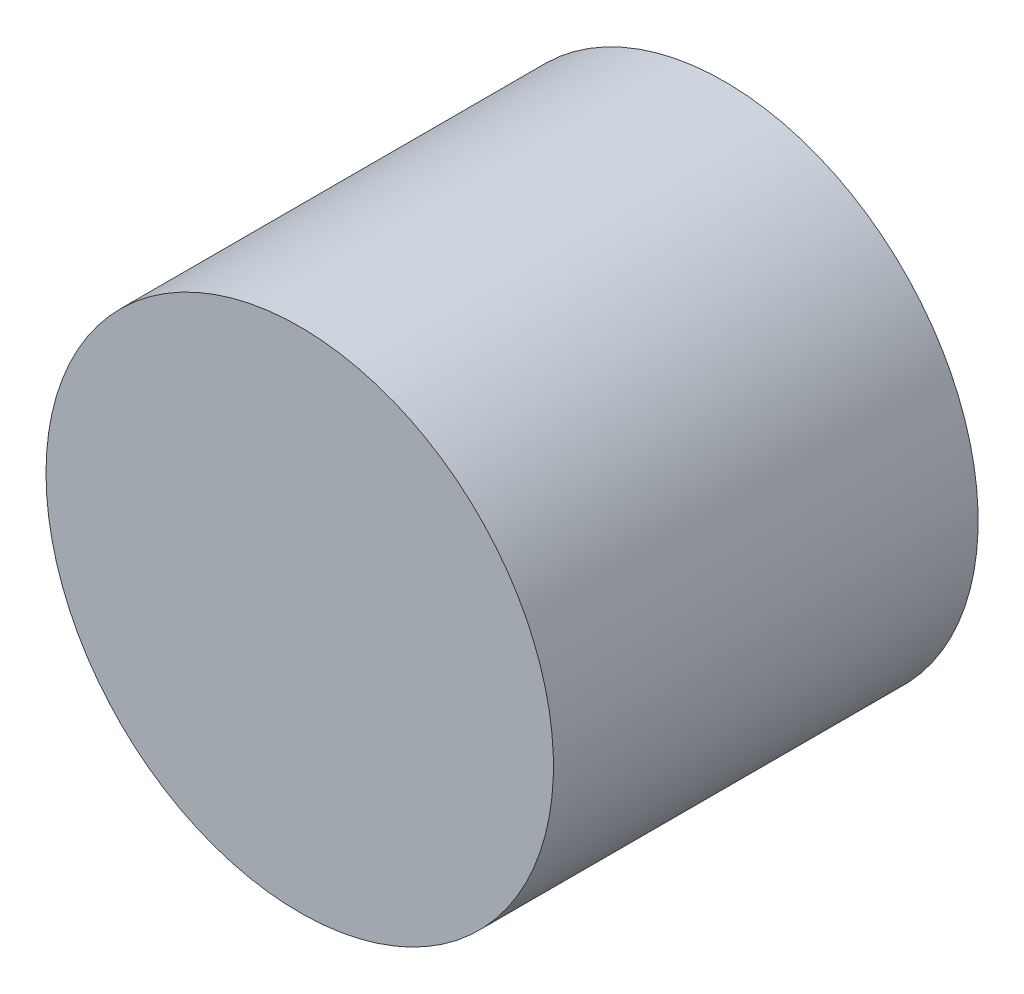
ISO-10303-21;
HEADER;
FILE_DESCRIPTION(('STEP AP214'),'2;1');
FILE_NAME('part.step','',(''),(''),'','','');
FILE_SCHEMA(('AUTOMOTIVE_DESIGN { 1 0 10303 214 1 1 1 1 }'));
ENDSEC;
DATA;
#1=APPLICATION_CONTEXT('core data for automotive mechanical design processes');
#2=APPLICATION_PROTOCOL_DEFINITION('international standard','automotive_design',2000,#1);
#3=PRODUCT_CONTEXT('',#1,'mechanical');
#4=PRODUCT('Part','Part','',(#3));
#5=PRODUCT_RELATED_PRODUCT_CATEGORY('part','',(#4));
#6=PRODUCT_DEFINITION_FORMATION('','',#4);
#7=PRODUCT_DEFINITION_CONTEXT('part definition',#1,'design');
#8=PRODUCT_DEFINITION('design','',#6,#7);
#9=PRODUCT_DEFINITION_SHAPE('','',#8);
#10=(LENGTH_UNIT() NAMED_UNIT(*) SI_UNIT(.MILLI.,.METRE.));
#11=(NAMED_UNIT(*) PLANE_ANGLE_UNIT() SI_UNIT($,.RADIAN.));
#12=(NAMED_UNIT(*) SI_UNIT($,.STERADIAN.) SOLID_ANGLE_UNIT());
#13=UNCERTAINTY_MEASURE_WITH_UNIT(LENGTH_MEASURE(1.E-05),#10,'distance_accuracy_value','');
#14=(GEOMETRIC_REPRESENTATION_CONTEXT(3) GLOBAL_UNCERTAINTY_ASSIGNED_CONTEXT((#13)) GLOBAL_UNIT_ASSIGNED_CONTEXT((#10,
#11,#12)) REPRESENTATION_CONTEXT('',''));
#15=CARTESIAN_POINT('',(0.,0.,0.));
#16=DIRECTION('',(0.,0.,1.));
#17=DIRECTION('',(1.,0.,0.));
#18=AXIS2_PLACEMENT_3D('',#15,#16,#17);
#19=CARTESIAN_POINT('',(-0.73937913570371,0.684339816773041,7.7));
#20=DIRECTION('',(0.,0.,-1.));
#21=DIRECTION('',(-1.,0.,0.));
#22=AXIS2_PLACEMENT_3D('',#19,#20,#21);
#23=CYLINDRICAL_SURFACE('',#22,4.59999999999999);
#24=CARTESIAN_POINT('',(-0.73937913570371,0.684339816773041,7.7));
#25=DIRECTION('',(0.,0.,1.));
#26=DIRECTION('',(1.,0.,0.));
#27=AXIS2_PLACEMENT_3D('',#24,#25,#26);
#28=CIRCLE('',#27,4.59999999999999);
#29=CARTESIAN_POINT('',(-5.3393791357037,0.684339816773041,7.7));
#30=VERTEX_POINT('',#29);
#31=EDGE_CURVE('E10',#30,#30,#28,.T.);
#32=CARTESIAN_POINT('',(-0.73937913570371,0.684339816773041,0.));
#33=DIRECTION('',(0.,0.,1.));
#34=DIRECTION('',(1.,0.,0.));
#35=AXIS2_PLACEMENT_3D('',#32,#33,#34);
#36=CIRCLE('',#35,4.59999999999999);
#37=CARTESIAN_POINT('',(-5.3393791357037,0.684339816773041,0.));
#38=VERTEX_POINT('',#37);
#39=EDGE_CURVE('E38',#38,#38,#36,.T.);
#40=CARTESIAN_POINT('',(-5.3393791357037,0.684339816773041,7.7));
#41=CARTESIAN_POINT('',(-5.3393791357037,0.684339816773041,7.61979166666667));
#42=CARTESIAN_POINT('',(-5.3393791357037,0.684339816773041,7.53958333333333));
#43=CARTESIAN_POINT('',(-5.3393791357037,0.684339816773041,7.37916666666667));
#44=CARTESIAN_POINT('',(-5.3393791357037,0.684339816773041,7.29895833333333));
#45=CARTESIAN_POINT('',(-5.3393791357037,0.684339816773041,7.13854166666667));
#46=CARTESIAN_POINT('',(-5.3393791357037,0.684339816773041,7.05833333333333));
#47=CARTESIAN_POINT('',(-5.3393791357037,0.684339816773041,6.89791666666667));
#48=CARTESIAN_POINT('',(-5.3393791357037,0.684339816773041,6.81770833333333));
#49=CARTESIAN_POINT('',(-5.3393791357037,0.684339816773041,6.65729166666667));
#50=CARTESIAN_POINT('',(-5.3393791357037,0.684339816773041,6.57708333333333));
#51=CARTESIAN_POINT('',(-5.3393791357037,0.684339816773041,6.41666666666667));
#52=CARTESIAN_POINT('',(-5.3393791357037,0.684339816773041,6.33645833333333));
#53=CARTESIAN_POINT('',(-5.3393791357037,0.684339816773041,6.17604166666667));
#54=CARTESIAN_POINT('',(-5.3393791357037,0.684339816773041,6.09583333333333));
#55=CARTESIAN_POINT('',(-5.3393791357037,0.684339816773041,5.93541666666667));
#56=CARTESIAN_POINT('',(-5.3393791357037,0.684339816773041,5.85520833333333));
#57=CARTESIAN_POINT('',(-5.3393791357037,0.684339816773041,5.69479166666667));
#58=CARTESIAN_POINT('',(-5.3393791357037,0.684339816773041,5.61458333333333));
#59=CARTESIAN_POINT('',(-5.3393791357037,0.684339816773041,5.45416666666667));
#60=CARTESIAN_POINT('',(-5.3393791357037,0.684339816773041,5.37395833333333));
#61=CARTESIAN_POINT('',(-5.3393791357037,0.684339816773041,5.21354166666667));
#62=CARTESIAN_POINT('',(-5.3393791357037,0.684339816773041,5.13333333333333));
#63=CARTESIAN_POINT('',(-5.3393791357037,0.684339816773041,4.97291666666667));
#64=CARTESIAN_POINT('',(-5.3393791357037,0.684339816773041,4.89270833333333));
#65=CARTESIAN_POINT('',(-5.3393791357037,0.684339816773041,4.73229166666667));
#66=CARTESIAN_POINT('',(-5.3393791357037,0.684339816773041,4.65208333333333));
#67=CARTESIAN_POINT('',(-5.3393791357037,0.684339816773041,4.49166666666667));
#68=CARTESIAN_POINT('',(-5.3393791357037,0.684339816773041,4.41145833333333));
#69=CARTESIAN_POINT('',(-5.3393791357037,0.684339816773041,4.25104166666667));
#70=CARTESIAN_POINT('',(-5.3393791357037,0.684339816773041,4.17083333333333));
#71=CARTESIAN_POINT('',(-5.3393791357037,0.684339816773041,4.01041666666667));
#72=CARTESIAN_POINT('',(-5.3393791357037,0.684339816773041,3.93020833333333));
#73=CARTESIAN_POINT('',(-5.3393791357037,0.684339816773041,3.76979166666667));
#74=CARTESIAN_POINT('',(-5.3393791357037,0.684339816773041,3.68958333333333));
#75=CARTESIAN_POINT('',(-5.3393791357037,0.684339816773041,3.52916666666667));
#76=CARTESIAN_POINT('',(-5.3393791357037,0.684339816773041,3.44895833333333));
#77=CARTESIAN_POINT('',(-5.3393791357037,0.684339816773041,3.28854166666667));
#78=CARTESIAN_POINT('',(-5.3393791357037,0.684339816773041,3.20833333333333));
#79=CARTESIAN_POINT('',(-5.3393791357037,0.684339816773041,3.04791666666667));
#80=CARTESIAN_POINT('',(-5.3393791357037,0.684339816773041,2.96770833333333));
#81=CARTESIAN_POINT('',(-5.3393791357037,0.684339816773041,2.80729166666667));
#82=CARTESIAN_POINT('',(-5.3393791357037,0.684339816773041,2.72708333333333));
#83=CARTESIAN_POINT('',(-5.3393791357037,0.684339816773041,2.56666666666667));
#84=CARTESIAN_POINT('',(-5.3393791357037,0.684339816773041,2.48645833333333));
#85=CARTESIAN_POINT('',(-5.3393791357037,0.684339816773041,2.32604166666667));
#86=CARTESIAN_POINT('',(-5.3393791357037,0.684339816773041,2.24583333333333));
#87=CARTESIAN_POINT('',(-5.3393791357037,0.684339816773041,2.08541666666667));
#88=CARTESIAN_POINT('',(-5.3393791357037,0.684339816773041,2.00520833333333));
#89=CARTESIAN_POINT('',(-5.3393791357037,0.684339816773041,1.84479166666667));
#90=CARTESIAN_POINT('',(-5.3393791357037,0.684339816773041,1.76458333333333));
#91=CARTESIAN_POINT('',(-5.3393791357037,0.684339816773041,1.60416666666667));
#92=CARTESIAN_POINT('',(-5.3393791357037,0.684339816773041,1.52395833333333));
#93=CARTESIAN_POINT('',(-5.3393791357037,0.684339816773041,1.36354166666667));
#94=CARTESIAN_POINT('',(-5.3393791357037,0.684339816773041,1.28333333333333));
#95=CARTESIAN_POINT('',(-5.3393791357037,0.684339816773041,1.12291666666667));
#96=CARTESIAN_POINT('',(-5.3393791357037,0.684339816773041,1.04270833333333));
#97=CARTESIAN_POINT('',(-5.3393791357037,0.684339816773041,0.882291666666666));
#98=CARTESIAN_POINT('',(-5.3393791357037,0.684339816773041,0.802083333333333));
#99=CARTESIAN_POINT('',(-5.3393791357037,0.684339816773041,0.641666666666666));
#100=CARTESIAN_POINT('',(-5.3393791357037,0.684339816773041,0.561458333333332));
#101=CARTESIAN_POINT('',(-5.3393791357037,0.684339816773041,0.401041666666666));
#102=CARTESIAN_POINT('',(-5.3393791357037,0.684339816773041,0.320833333333333));
#103=CARTESIAN_POINT('',(-5.3393791357037,0.684339816773041,0.160416666666666));
#104=CARTESIAN_POINT('',(-5.3393791357037,0.684339816773041,0.0802083333333325));
#105=CARTESIAN_POINT('',(-5.3393791357037,0.684339816773041,0.));
#106=B_SPLINE_CURVE_WITH_KNOTS('',3,(#40,#41,#42,#43,#44,#45,#46,#47,#48,#49,#50,#51,#52,#53,
#54,#55,#56,#57,#58,#59,#60,#61,#62,#63,#64,#65,#66,#67,#68,#69,#70,#71,#72,#73,#74,#75,#76,#77,
#78,#79,#80,#81,#82,#83,#84,#85,#86,#87,#88,#89,#90,#91,#92,#93,#94,#95,#96,#97,#98,#99,#100,
#101,#102,#103,#104,#105),.UNSPECIFIED.,.F.,.F.,(4,2,2,2,2,2,2,2,2,2,2,2,2,2,2,2,2,2,2,2,2,2,2,
2,2,2,2,2,2,2,2,2,4),(0.,0.240625,0.481250000000001,0.721875,0.962500000000001,1.203125,1.44375,
1.684375,1.925,2.165625,2.40625,2.646875,2.8875,3.128125,3.36875,3.609375,3.85,4.090625,4.33125,
4.571875,4.8125,5.053125,5.29375,5.534375,5.775,6.015625,6.25625,6.496875,6.7375,6.978125,
7.21875,7.459375,7.7),.UNSPECIFIED.);
#107=EDGE_CURVE('BSEAM35',#30,#38,#106,.T.);
#108=ORIENTED_EDGE('',*,*,#31,.F.);
#109=ORIENTED_EDGE('',*,*,#39,.T.);
#110=ORIENTED_EDGE('',*,*,#107,.T.);
#111=ORIENTED_EDGE('',*,*,#107,.F.);
#112=EDGE_LOOP('',(#108,#110,#109,#111));
#113=FACE_BOUND('',#112,.T.);
#114=ADVANCED_FACE('F35',(#113),#23,.T.);
#115=CARTESIAN_POINT('',(-0.73937913570371,0.684339816773041,7.7));
#116=DIRECTION('',(0.,0.,1.));
#117=DIRECTION('',(1.,0.,0.));
#118=AXIS2_PLACEMENT_3D('',#115,#116,#117);
#119=PLANE('',#118);
#120=ORIENTED_EDGE('',*,*,#31,.T.);
#121=EDGE_LOOP('',(#120));
#122=FACE_BOUND('',#121,.T.);
#123=ADVANCED_FACE('F50',(#122),#119,.T.);
#124=CARTESIAN_POINT('',(-0.73937913570371,0.684339816773041,0.));
#125=DIRECTION('',(0.,0.,1.));
#126=DIRECTION('',(1.,0.,0.));
#127=AXIS2_PLACEMENT_3D('',#124,#125,#126);
#128=PLANE('',#127);
#129=ORIENTED_EDGE('',*,*,#39,.F.);
#130=EDGE_LOOP('',(#129));
#131=FACE_BOUND('',#130,.T.);
#132=ADVANCED_FACE('F48',(#131),#128,.F.);
#133=CLOSED_SHELL('',(#114,#123,#132));
#134=MANIFOLD_SOLID_BREP('B2',#133);
#135=ADVANCED_BREP_SHAPE_REPRESENTATION('',(#18,#134),#14);
#136=SHAPE_DEFINITION_REPRESENTATION(#9,#135);
ENDSEC;
END-ISO-10303-21;
